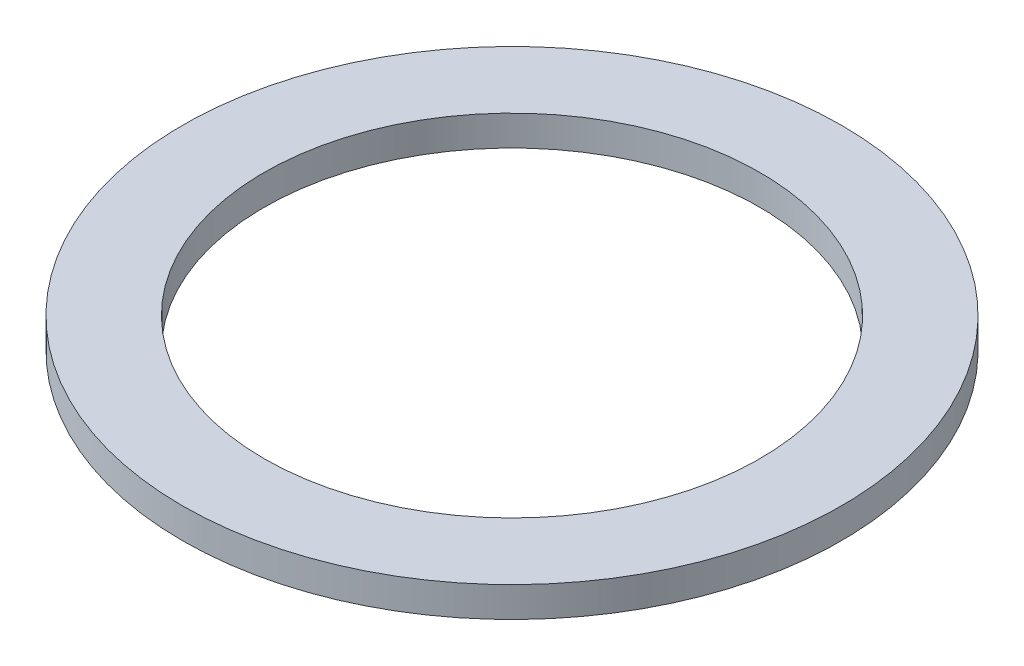
ISO-10303-21;
HEADER;
FILE_DESCRIPTION(('STEP AP214'),'2;1');
FILE_NAME('part.step','',(''),(''),'','','');
FILE_SCHEMA(('AUTOMOTIVE_DESIGN { 1 0 10303 214 1 1 1 1 }'));
ENDSEC;
DATA;
#1=APPLICATION_CONTEXT('core data for automotive mechanical design processes');
#2=APPLICATION_PROTOCOL_DEFINITION('international standard','automotive_design',2000,#1);
#3=PRODUCT_CONTEXT('',#1,'mechanical');
#4=PRODUCT('Part','Part','',(#3));
#5=PRODUCT_RELATED_PRODUCT_CATEGORY('part','',(#4));
#6=PRODUCT_DEFINITION_FORMATION('','',#4);
#7=PRODUCT_DEFINITION_CONTEXT('part definition',#1,'design');
#8=PRODUCT_DEFINITION('design','',#6,#7);
#9=PRODUCT_DEFINITION_SHAPE('','',#8);
#10=(LENGTH_UNIT() NAMED_UNIT(*) SI_UNIT(.MILLI.,.METRE.));
#11=(NAMED_UNIT(*) PLANE_ANGLE_UNIT() SI_UNIT($,.RADIAN.));
#12=(NAMED_UNIT(*) SI_UNIT($,.STERADIAN.) SOLID_ANGLE_UNIT());
#13=UNCERTAINTY_MEASURE_WITH_UNIT(LENGTH_MEASURE(1.E-05),#10,'distance_accuracy_value','');
#14=(GEOMETRIC_REPRESENTATION_CONTEXT(3) GLOBAL_UNCERTAINTY_ASSIGNED_CONTEXT((#13)) GLOBAL_UNIT_ASSIGNED_CONTEXT((#10,
#11,#12)) REPRESENTATION_CONTEXT('',''));
#15=CARTESIAN_POINT('',(0.,0.,0.));
#16=DIRECTION('',(0.,0.,1.));
#17=DIRECTION('',(1.,0.,0.));
#18=AXIS2_PLACEMENT_3D('',#15,#16,#17);
#19=CARTESIAN_POINT('',(0.,0.5,0.));
#20=DIRECTION('',(0.,1.,0.));
#21=DIRECTION('',(0.,0.,1.));
#22=AXIS2_PLACEMENT_3D('',#19,#20,#21);
#23=PLANE('',#22);
#24=CARTESIAN_POINT('',(0.,0.5,0.));
#25=DIRECTION('',(0.,1.,0.));
#26=DIRECTION('',(0.,0.,1.));
#27=AXIS2_PLACEMENT_3D('',#24,#25,#26);
#28=CIRCLE('',#27,5.45);
#29=CARTESIAN_POINT('',(0.,0.5,5.45));
#30=VERTEX_POINT('',#29);
#31=EDGE_CURVE('E10',#30,#30,#28,.T.);
#32=ORIENTED_EDGE('',*,*,#31,.T.);
#33=EDGE_LOOP('',(#32));
#34=FACE_BOUND('',#33,.T.);
#35=CARTESIAN_POINT('',(0.,0.5,0.));
#36=DIRECTION('',(0.,1.,0.));
#37=DIRECTION('',(0.,0.,1.));
#38=AXIS2_PLACEMENT_3D('',#35,#36,#37);
#39=CIRCLE('',#38,4.1);
#40=CARTESIAN_POINT('',(0.,0.5,4.1));
#41=VERTEX_POINT('',#40);
#42=EDGE_CURVE('E42',#41,#41,#39,.T.);
#43=ORIENTED_EDGE('',*,*,#42,.F.);
#44=EDGE_LOOP('',(#43));
#45=FACE_BOUND('',#44,.T.);
#46=ADVANCED_FACE('F31',(#34,#45),#23,.T.);
#47=CARTESIAN_POINT('',(0.,0.,0.));
#48=DIRECTION('',(0.,1.,0.));
#49=DIRECTION('',(0.,0.,1.));
#50=AXIS2_PLACEMENT_3D('',#47,#48,#49);
#51=PLANE('',#50);
#52=CARTESIAN_POINT('',(0.,0.,0.));
#53=DIRECTION('',(0.,1.,0.));
#54=DIRECTION('',(0.,0.,1.));
#55=AXIS2_PLACEMENT_3D('',#52,#53,#54);
#56=CIRCLE('',#55,5.45);
#57=CARTESIAN_POINT('',(0.,0.,5.45));
#58=VERTEX_POINT('',#57);
#59=EDGE_CURVE('E35',#58,#58,#56,.T.);
#60=ORIENTED_EDGE('',*,*,#59,.F.);
#61=EDGE_LOOP('',(#60));
#62=FACE_BOUND('',#61,.T.);
#63=CARTESIAN_POINT('',(0.,0.,0.));
#64=DIRECTION('',(0.,1.,0.));
#65=DIRECTION('',(0.,0.,1.));
#66=AXIS2_PLACEMENT_3D('',#63,#64,#65);
#67=CIRCLE('',#66,4.1);
#68=CARTESIAN_POINT('',(0.,0.,4.1));
#69=VERTEX_POINT('',#68);
#70=EDGE_CURVE('E44',#69,#69,#67,.T.);
#71=ORIENTED_EDGE('',*,*,#70,.T.);
#72=EDGE_LOOP('',(#71));
#73=FACE_BOUND('',#72,.T.);
#74=ADVANCED_FACE('F54',(#62,#73),#51,.F.);
#75=CARTESIAN_POINT('',(0.,0.5,0.));
#76=DIRECTION('',(0.,-1.,0.));
#77=DIRECTION('',(0.,0.,-1.));
#78=AXIS2_PLACEMENT_3D('',#75,#76,#77);
#79=CYLINDRICAL_SURFACE('',#78,5.45);
#80=ORIENTED_EDGE('',*,*,#31,.F.);
#81=EDGE_LOOP('',(#80));
#82=FACE_BOUND('',#81,.T.);
#83=ORIENTED_EDGE('',*,*,#59,.T.);
#84=EDGE_LOOP('',(#83));
#85=FACE_BOUND('',#84,.T.);
#86=ADVANCED_FACE('F33',(#82,#85),#79,.T.);
#87=CARTESIAN_POINT('',(0.,0.5,0.));
#88=DIRECTION('',(0.,-1.,0.));
#89=DIRECTION('',(0.,0.,-1.));
#90=AXIS2_PLACEMENT_3D('',#87,#88,#89);
#91=CYLINDRICAL_SURFACE('',#90,4.1);
#92=ORIENTED_EDGE('',*,*,#42,.T.);
#93=EDGE_LOOP('',(#92));
#94=FACE_BOUND('',#93,.T.);
#95=ORIENTED_EDGE('',*,*,#70,.F.);
#96=EDGE_LOOP('',(#95));
#97=FACE_BOUND('',#96,.T.);
#98=ADVANCED_FACE('F50',(#94,#97),#91,.F.);
#99=CLOSED_SHELL('',(#46,#74,#86,#98));
#100=MANIFOLD_SOLID_BREP('B2',#99);
#101=ADVANCED_BREP_SHAPE_REPRESENTATION('',(#18,#100),#14);
#102=SHAPE_DEFINITION_REPRESENTATION(#9,#101);
ENDSEC;
END-ISO-10303-21;
